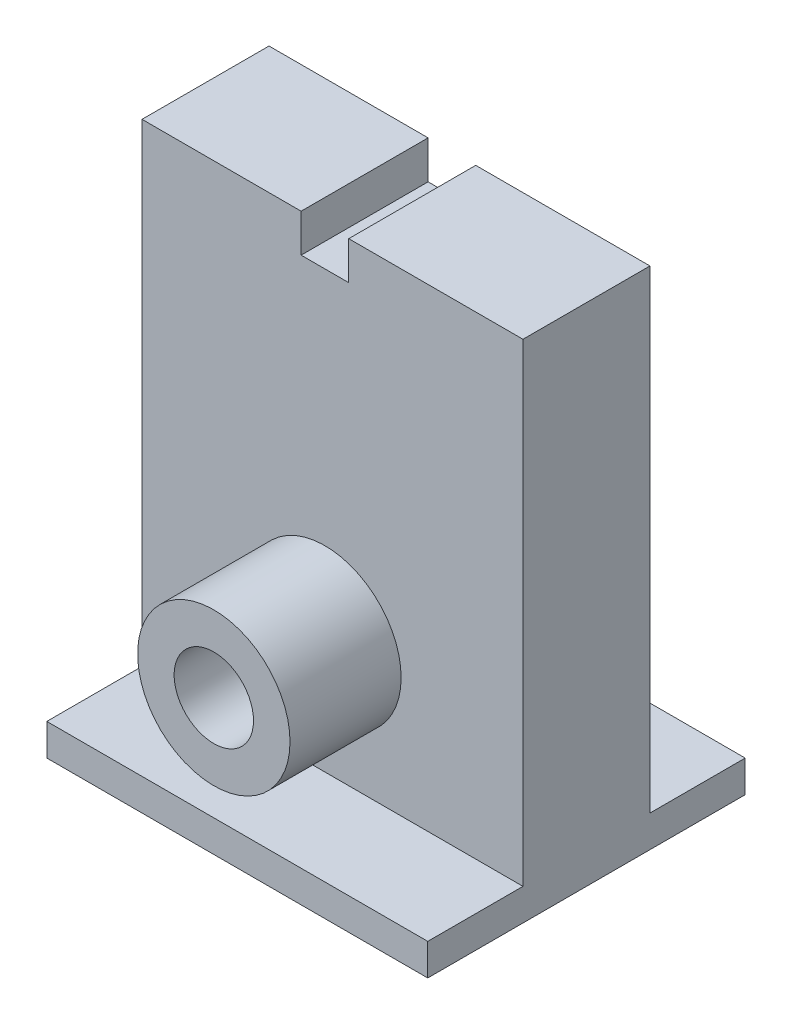
ISO-10303-21;
HEADER;
FILE_DESCRIPTION(('STEP AP214'),'2;1');
FILE_NAME('part.step','',(''),(''),'','','');
FILE_SCHEMA(('AUTOMOTIVE_DESIGN { 1 0 10303 214 1 1 1 1 }'));
ENDSEC;
DATA;
#1=APPLICATION_CONTEXT('core data for automotive mechanical design processes');
#2=APPLICATION_PROTOCOL_DEFINITION('international standard','automotive_design',2000,#1);
#3=PRODUCT_CONTEXT('',#1,'mechanical');
#4=PRODUCT('Part','Part','',(#3));
#5=PRODUCT_RELATED_PRODUCT_CATEGORY('part','',(#4));
#6=PRODUCT_DEFINITION_FORMATION('','',#4);
#7=PRODUCT_DEFINITION_CONTEXT('part definition',#1,'design');
#8=PRODUCT_DEFINITION('design','',#6,#7);
#9=PRODUCT_DEFINITION_SHAPE('','',#8);
#10=(LENGTH_UNIT() NAMED_UNIT(*) SI_UNIT(.MILLI.,.METRE.));
#11=(NAMED_UNIT(*) PLANE_ANGLE_UNIT() SI_UNIT($,.RADIAN.));
#12=(NAMED_UNIT(*) SI_UNIT($,.STERADIAN.) SOLID_ANGLE_UNIT());
#13=UNCERTAINTY_MEASURE_WITH_UNIT(LENGTH_MEASURE(1.E-05),#10,'distance_accuracy_value','');
#14=(GEOMETRIC_REPRESENTATION_CONTEXT(3) GLOBAL_UNCERTAINTY_ASSIGNED_CONTEXT((#13)) GLOBAL_UNIT_ASSIGNED_CONTEXT((#10,
#11,#12)) REPRESENTATION_CONTEXT('',''));
#15=CARTESIAN_POINT('',(0.,0.,0.));
#16=DIRECTION('',(0.,0.,1.));
#17=DIRECTION('',(1.,0.,0.));
#18=AXIS2_PLACEMENT_3D('',#15,#16,#17);
#19=CARTESIAN_POINT('',(-57.6145024875622,24.0242288557214,40.));
#20=DIRECTION('',(0.,-1.,0.));
#21=DIRECTION('',(0.,0.,-1.));
#22=AXIS2_PLACEMENT_3D('',#19,#20,#21);
#23=PLANE('',#22);
#24=DIRECTION('',(0.,0.,-1.));
#25=VECTOR('',#24,1.);
#26=CARTESIAN_POINT('',(-7.5,24.0242288557214,0.));
#27=LINE('',#26,#25);
#28=CARTESIAN_POINT('',(-7.5,24.0242288557214,40.));
#29=VERTEX_POINT('',#28);
#30=CARTESIAN_POINT('',(-7.5,24.0242288557214,0.));
#31=VERTEX_POINT('',#30);
#32=EDGE_CURVE('E198',#29,#31,#27,.T.);
#33=ORIENTED_EDGE('',*,*,#32,.F.);
#34=DIRECTION('',(-1.,0.,0.));
#35=VECTOR('',#34,1.);
#36=CARTESIAN_POINT('',(-57.6145024875622,24.0242288557214,40.));
#37=LINE('',#36,#35);
#38=CARTESIAN_POINT('',(7.50000000000001,24.0242288557214,40.));
#39=VERTEX_POINT('',#38);
#40=EDGE_CURVE('E237',#39,#29,#37,.T.);
#41=ORIENTED_EDGE('',*,*,#40,.F.);
#42=DIRECTION('',(0.,0.,1.));
#43=VECTOR('',#42,1.);
#44=CARTESIAN_POINT('',(7.5,24.0242288557214,0.));
#45=LINE('',#44,#43);
#46=CARTESIAN_POINT('',(7.5,24.0242288557214,0.));
#47=VERTEX_POINT('',#46);
#48=EDGE_CURVE('E208',#47,#39,#45,.T.);
#49=ORIENTED_EDGE('',*,*,#48,.F.);
#50=DIRECTION('',(-1.,0.,0.));
#51=VECTOR('',#50,1.);
#52=CARTESIAN_POINT('',(-57.6145024875622,24.0242288557214,0.));
#53=LINE('',#52,#51);
#54=EDGE_CURVE('E235',#47,#31,#53,.T.);
#55=ORIENTED_EDGE('',*,*,#54,.T.);
#56=EDGE_LOOP('',(#33,#41,#49,#55));
#57=FACE_BOUND('',#56,.T.);
#58=ADVANCED_FACE('F41',(#57),#23,.F.);
#59=CARTESIAN_POINT('',(-57.6145024875622,-123.225771144279,40.));
#60=DIRECTION('',(1.,0.,0.));
#61=DIRECTION('',(0.,1.,0.));
#62=AXIS2_PLACEMENT_3D('',#59,#60,#61);
#63=PLANE('',#62);
#64=DIRECTION('',(0.,-1.,0.));
#65=VECTOR('',#64,1.);
#66=CARTESIAN_POINT('',(-57.6145024875622,-123.225771144279,0.));
#67=LINE('',#66,#65);
#68=CARTESIAN_POINT('',(-57.6145024875622,36.0242288557214,0.));
#69=VERTEX_POINT('',#68);
#70=CARTESIAN_POINT('',(-57.6145024875622,-113.225771144279,0.));
#71=VERTEX_POINT('',#70);
#72=EDGE_CURVE('E214',#69,#71,#67,.T.);
#73=ORIENTED_EDGE('',*,*,#72,.T.);
#74=DIRECTION('',(0.,0.,-1.));
#75=VECTOR('',#74,1.);
#76=CARTESIAN_POINT('',(-57.6145024875622,-113.225771144279,-30.));
#77=LINE('',#76,#75);
#78=CARTESIAN_POINT('',(-57.6145024875622,-113.225771144279,-30.));
#79=VERTEX_POINT('',#78);
#80=EDGE_CURVE('E146',#71,#79,#77,.T.);
#81=ORIENTED_EDGE('',*,*,#80,.T.);
#82=DIRECTION('',(0.,-1.,0.));
#83=VECTOR('',#82,1.);
#84=CARTESIAN_POINT('',(-57.6145024875622,-113.225771144279,-30.));
#85=LINE('',#84,#83);
#86=CARTESIAN_POINT('',(-57.6145024875622,-123.225771144279,-30.));
#87=VERTEX_POINT('',#86);
#88=EDGE_CURVE('E137',#79,#87,#85,.T.);
#89=ORIENTED_EDGE('',*,*,#88,.T.);
#90=DIRECTION('',(0.,0.,-1.));
#91=VECTOR('',#90,1.);
#92=CARTESIAN_POINT('',(-57.6145024875622,-123.225771144279,40.));
#93=LINE('',#92,#91);
#94=CARTESIAN_POINT('',(-57.6145024875622,-123.225771144279,70.));
#95=VERTEX_POINT('',#94);
#96=EDGE_CURVE('E132',#95,#87,#93,.T.);
#97=ORIENTED_EDGE('',*,*,#96,.F.);
#98=DIRECTION('',(0.,-1.,0.));
#99=VECTOR('',#98,1.);
#100=CARTESIAN_POINT('',(-57.6145024875622,-113.225771144279,70.));
#101=LINE('',#100,#99);
#102=CARTESIAN_POINT('',(-57.6145024875622,-113.225771144279,70.));
#103=VERTEX_POINT('',#102);
#104=EDGE_CURVE('E127',#103,#95,#101,.T.);
#105=ORIENTED_EDGE('',*,*,#104,.F.);
#106=CARTESIAN_POINT('',(-57.6145024875622,-113.225771144279,40.));
#107=VERTEX_POINT('',#106);
#108=EDGE_CURVE('E130',#103,#107,#77,.T.);
#109=ORIENTED_EDGE('',*,*,#108,.T.);
#110=DIRECTION('',(0.,-1.,0.));
#111=VECTOR('',#110,1.);
#112=CARTESIAN_POINT('',(-57.6145024875622,-123.225771144279,40.));
#113=LINE('',#112,#111);
#114=CARTESIAN_POINT('',(-57.6145024875622,36.0242288557214,40.));
#115=VERTEX_POINT('',#114);
#116=EDGE_CURVE('E61',#115,#107,#113,.T.);
#117=ORIENTED_EDGE('',*,*,#116,.F.);
#118=DIRECTION('',(0.,0.,1.));
#119=VECTOR('',#118,1.);
#120=CARTESIAN_POINT('',(-57.6145024875622,36.0242288557214,40.));
#121=LINE('',#120,#119);
#122=EDGE_CURVE('E194',#69,#115,#121,.T.);
#123=ORIENTED_EDGE('',*,*,#122,.F.);
#124=EDGE_LOOP('',(#73,#81,#89,#97,#105,#109,#117,#123));
#125=FACE_BOUND('',#124,.T.);
#126=ADVANCED_FACE('F43',(#125),#63,.F.);
#127=CARTESIAN_POINT('',(62.3854975124378,-123.225771144279,40.));
#128=DIRECTION('',(0.,1.,0.));
#129=DIRECTION('',(-1.,0.,0.));
#130=AXIS2_PLACEMENT_3D('',#127,#128,#129);
#131=PLANE('',#130);
#132=ORIENTED_EDGE('',*,*,#96,.T.);
#133=DIRECTION('',(1.,0.,0.));
#134=VECTOR('',#133,1.);
#135=CARTESIAN_POINT('',(-57.6145024875622,-123.225771144279,-30.));
#136=LINE('',#135,#134);
#137=CARTESIAN_POINT('',(62.3854975124378,-123.225771144279,-30.));
#138=VERTEX_POINT('',#137);
#139=EDGE_CURVE('E152',#87,#138,#136,.T.);
#140=ORIENTED_EDGE('',*,*,#139,.T.);
#141=DIRECTION('',(0.,0.,-1.));
#142=VECTOR('',#141,1.);
#143=CARTESIAN_POINT('',(62.3854975124378,-123.225771144279,40.));
#144=LINE('',#143,#142);
#145=CARTESIAN_POINT('',(62.3854975124378,-123.225771144279,70.));
#146=VERTEX_POINT('',#145);
#147=EDGE_CURVE('E240',#146,#138,#144,.T.);
#148=ORIENTED_EDGE('',*,*,#147,.F.);
#149=DIRECTION('',(-1.,0.,0.));
#150=VECTOR('',#149,1.);
#151=CARTESIAN_POINT('',(-57.6145024875622,-123.225771144279,70.));
#152=LINE('',#151,#150);
#153=EDGE_CURVE('E155',#146,#95,#152,.T.);
#154=ORIENTED_EDGE('',*,*,#153,.T.);
#155=EDGE_LOOP('',(#132,#140,#148,#154));
#156=FACE_BOUND('',#155,.T.);
#157=ADVANCED_FACE('F246',(#156),#131,.F.);
#158=CARTESIAN_POINT('',(62.3854975124378,24.0242288557214,40.));
#159=DIRECTION('',(-1.,0.,0.));
#160=DIRECTION('',(0.,-1.,0.));
#161=AXIS2_PLACEMENT_3D('',#158,#159,#160);
#162=PLANE('',#161);
#163=DIRECTION('',(0.,1.,0.));
#164=VECTOR('',#163,1.);
#165=CARTESIAN_POINT('',(62.3854975124378,24.0242288557214,40.));
#166=LINE('',#165,#164);
#167=CARTESIAN_POINT('',(62.3854975124378,-113.225771144279,40.));
#168=VERTEX_POINT('',#167);
#169=CARTESIAN_POINT('',(62.3854975124378,36.0242288557214,40.));
#170=VERTEX_POINT('',#169);
#171=EDGE_CURVE('E234',#168,#170,#166,.T.);
#172=ORIENTED_EDGE('',*,*,#171,.F.);
#173=DIRECTION('',(0.,0.,1.));
#174=VECTOR('',#173,1.);
#175=CARTESIAN_POINT('',(62.3854975124378,-113.225771144279,70.));
#176=LINE('',#175,#174);
#177=CARTESIAN_POINT('',(62.3854975124378,-113.225771144279,70.));
#178=VERTEX_POINT('',#177);
#179=EDGE_CURVE('E160',#168,#178,#176,.T.);
#180=ORIENTED_EDGE('',*,*,#179,.T.);
#181=DIRECTION('',(0.,-1.,0.));
#182=VECTOR('',#181,1.);
#183=CARTESIAN_POINT('',(62.3854975124378,-113.225771144279,70.));
#184=LINE('',#183,#182);
#185=EDGE_CURVE('E151',#178,#146,#184,.T.);
#186=ORIENTED_EDGE('',*,*,#185,.T.);
#187=ORIENTED_EDGE('',*,*,#147,.T.);
#188=DIRECTION('',(0.,-1.,0.));
#189=VECTOR('',#188,1.);
#190=CARTESIAN_POINT('',(62.3854975124378,-113.225771144279,-30.));
#191=LINE('',#190,#189);
#192=CARTESIAN_POINT('',(62.3854975124378,-113.225771144279,-30.));
#193=VERTEX_POINT('',#192);
#194=EDGE_CURVE('E165',#193,#138,#191,.T.);
#195=ORIENTED_EDGE('',*,*,#194,.F.);
#196=CARTESIAN_POINT('',(62.3854975124378,-113.225771144279,0.));
#197=VERTEX_POINT('',#196);
#198=EDGE_CURVE('E138',#193,#197,#176,.T.);
#199=ORIENTED_EDGE('',*,*,#198,.T.);
#200=DIRECTION('',(0.,1.,0.));
#201=VECTOR('',#200,1.);
#202=CARTESIAN_POINT('',(62.3854975124378,24.0242288557214,0.));
#203=LINE('',#202,#201);
#204=CARTESIAN_POINT('',(62.3854975124378,36.0242288557214,0.));
#205=VERTEX_POINT('',#204);
#206=EDGE_CURVE('E242',#197,#205,#203,.T.);
#207=ORIENTED_EDGE('',*,*,#206,.T.);
#208=DIRECTION('',(0.,0.,-1.));
#209=VECTOR('',#208,1.);
#210=CARTESIAN_POINT('',(62.3854975124378,36.0242288557214,40.));
#211=LINE('',#210,#209);
#212=EDGE_CURVE('E220',#170,#205,#211,.T.);
#213=ORIENTED_EDGE('',*,*,#212,.F.);
#214=EDGE_LOOP('',(#172,#180,#186,#187,#195,#199,#207,#213));
#215=FACE_BOUND('',#214,.T.);
#216=ADVANCED_FACE('F254',(#215),#162,.F.);
#217=CARTESIAN_POINT('',(0.,0.,40.));
#218=DIRECTION('',(0.,0.,-1.));
#219=DIRECTION('',(-1.,0.,0.));
#220=AXIS2_PLACEMENT_3D('',#217,#218,#219);
#221=PLANE('',#220);
#222=CARTESIAN_POINT('',(0.,-75.4757711442786,40.));
#223=DIRECTION('',(0.,0.,1.));
#224=DIRECTION('',(1.,0.,0.));
#225=AXIS2_PLACEMENT_3D('',#222,#223,#224);
#226=CIRCLE('',#225,24.);
#227=CARTESIAN_POINT('',(24.,-75.4757711442786,40.));
#228=VERTEX_POINT('',#227);
#229=EDGE_CURVE('E176',#228,#228,#226,.T.);
#230=ORIENTED_EDGE('',*,*,#229,.F.);
#231=EDGE_LOOP('',(#230));
#232=FACE_BOUND('',#231,.T.);
#233=ORIENTED_EDGE('',*,*,#116,.T.);
#234=DIRECTION('',(1.,0.,0.));
#235=VECTOR('',#234,1.);
#236=CARTESIAN_POINT('',(0.,-113.225771144279,40.));
#237=LINE('',#236,#235);
#238=EDGE_CURVE('E56',#107,#168,#237,.T.);
#239=ORIENTED_EDGE('',*,*,#238,.T.);
#240=ORIENTED_EDGE('',*,*,#171,.T.);
#241=DIRECTION('',(1.,0.,0.));
#242=VECTOR('',#241,1.);
#243=CARTESIAN_POINT('',(7.50000000000001,36.0242288557214,40.));
#244=LINE('',#243,#242);
#245=CARTESIAN_POINT('',(7.50000000000001,36.0242288557214,40.));
#246=VERTEX_POINT('',#245);
#247=EDGE_CURVE('E226',#246,#170,#244,.T.);
#248=ORIENTED_EDGE('',*,*,#247,.F.);
#249=DIRECTION('',(0.,-1.,0.));
#250=VECTOR('',#249,1.);
#251=CARTESIAN_POINT('',(7.50000000000001,36.0242288557214,40.));
#252=LINE('',#251,#250);
#253=EDGE_CURVE('E217',#246,#39,#252,.T.);
#254=ORIENTED_EDGE('',*,*,#253,.T.);
#255=ORIENTED_EDGE('',*,*,#40,.T.);
#256=DIRECTION('',(0.,-1.,0.));
#257=VECTOR('',#256,1.);
#258=CARTESIAN_POINT('',(-7.5,36.0242288557214,40.));
#259=LINE('',#258,#257);
#260=CARTESIAN_POINT('',(-7.5,36.0242288557214,40.));
#261=VERTEX_POINT('',#260);
#262=EDGE_CURVE('E211',#261,#29,#259,.T.);
#263=ORIENTED_EDGE('',*,*,#262,.F.);
#264=DIRECTION('',(1.,0.,0.));
#265=VECTOR('',#264,1.);
#266=CARTESIAN_POINT('',(-7.5,36.0242288557214,40.));
#267=LINE('',#266,#265);
#268=EDGE_CURVE('E197',#115,#261,#267,.T.);
#269=ORIENTED_EDGE('',*,*,#268,.F.);
#270=EDGE_LOOP('',(#233,#239,#240,#248,#254,#255,#263,#269));
#271=FACE_BOUND('',#270,.T.);
#272=ADVANCED_FACE('F258',(#232,#271),#221,.F.);
#273=CARTESIAN_POINT('',(0.,0.,0.));
#274=DIRECTION('',(0.,0.,-1.));
#275=DIRECTION('',(-1.,0.,0.));
#276=AXIS2_PLACEMENT_3D('',#273,#274,#275);
#277=PLANE('',#276);
#278=DIRECTION('',(1.,0.,0.));
#279=VECTOR('',#278,1.);
#280=CARTESIAN_POINT('',(0.,-113.225771144279,0.));
#281=LINE('',#280,#279);
#282=EDGE_CURVE('E11',#71,#197,#281,.T.);
#283=ORIENTED_EDGE('',*,*,#282,.F.);
#284=ORIENTED_EDGE('',*,*,#72,.F.);
#285=DIRECTION('',(-1.,0.,0.));
#286=VECTOR('',#285,1.);
#287=CARTESIAN_POINT('',(-57.6145024875622,36.0242288557214,0.));
#288=LINE('',#287,#286);
#289=CARTESIAN_POINT('',(-7.5,36.0242288557214,0.));
#290=VERTEX_POINT('',#289);
#291=EDGE_CURVE('E202',#290,#69,#288,.T.);
#292=ORIENTED_EDGE('',*,*,#291,.F.);
#293=DIRECTION('',(0.,-1.,0.));
#294=VECTOR('',#293,1.);
#295=CARTESIAN_POINT('',(-7.5,36.0242288557214,0.));
#296=LINE('',#295,#294);
#297=EDGE_CURVE('E205',#290,#31,#296,.T.);
#298=ORIENTED_EDGE('',*,*,#297,.T.);
#299=ORIENTED_EDGE('',*,*,#54,.F.);
#300=DIRECTION('',(0.,-1.,0.));
#301=VECTOR('',#300,1.);
#302=CARTESIAN_POINT('',(7.5,36.0242288557214,0.));
#303=LINE('',#302,#301);
#304=CARTESIAN_POINT('',(7.5,36.0242288557214,0.));
#305=VERTEX_POINT('',#304);
#306=EDGE_CURVE('E191',#305,#47,#303,.T.);
#307=ORIENTED_EDGE('',*,*,#306,.F.);
#308=DIRECTION('',(-1.,0.,0.));
#309=VECTOR('',#308,1.);
#310=CARTESIAN_POINT('',(62.3854975124378,36.0242288557214,0.));
#311=LINE('',#310,#309);
#312=EDGE_CURVE('E223',#205,#305,#311,.T.);
#313=ORIENTED_EDGE('',*,*,#312,.F.);
#314=ORIENTED_EDGE('',*,*,#206,.F.);
#315=EDGE_LOOP('',(#283,#284,#292,#298,#299,#307,#313,#314));
#316=FACE_BOUND('',#315,.T.);
#317=CARTESIAN_POINT('',(0.,-75.4757711442786,0.));
#318=DIRECTION('',(0.,0.,1.));
#319=DIRECTION('',(1.,0.,0.));
#320=AXIS2_PLACEMENT_3D('',#317,#318,#319);
#321=CIRCLE('',#320,24.);
#322=CARTESIAN_POINT('',(24.,-75.4757711442786,0.));
#323=VERTEX_POINT('',#322);
#324=EDGE_CURVE('E173',#323,#323,#321,.T.);
#325=ORIENTED_EDGE('',*,*,#324,.T.);
#326=EDGE_LOOP('',(#325));
#327=FACE_BOUND('',#326,.T.);
#328=ADVANCED_FACE('F278',(#316,#327),#277,.T.);
#329=CARTESIAN_POINT('',(7.5,36.0242288557214,0.));
#330=DIRECTION('',(1.,0.,0.));
#331=DIRECTION('',(0.,0.,-1.));
#332=AXIS2_PLACEMENT_3D('',#329,#330,#331);
#333=PLANE('',#332);
#334=ORIENTED_EDGE('',*,*,#48,.T.);
#335=ORIENTED_EDGE('',*,*,#253,.F.);
#336=DIRECTION('',(0.,0.,1.));
#337=VECTOR('',#336,1.);
#338=CARTESIAN_POINT('',(7.5,36.0242288557214,0.));
#339=LINE('',#338,#337);
#340=EDGE_CURVE('E229',#305,#246,#339,.T.);
#341=ORIENTED_EDGE('',*,*,#340,.F.);
#342=ORIENTED_EDGE('',*,*,#306,.T.);
#343=EDGE_LOOP('',(#334,#335,#341,#342));
#344=FACE_BOUND('',#343,.T.);
#345=ADVANCED_FACE('F265',(#344),#333,.F.);
#346=CARTESIAN_POINT('',(0.,36.0242288557214,0.));
#347=DIRECTION('',(0.,1.,0.));
#348=DIRECTION('',(0.,0.,1.));
#349=AXIS2_PLACEMENT_3D('',#346,#347,#348);
#350=PLANE('',#349);
#351=ORIENTED_EDGE('',*,*,#312,.T.);
#352=ORIENTED_EDGE('',*,*,#340,.T.);
#353=ORIENTED_EDGE('',*,*,#247,.T.);
#354=ORIENTED_EDGE('',*,*,#212,.T.);
#355=EDGE_LOOP('',(#351,#352,#353,#354));
#356=FACE_BOUND('',#355,.T.);
#357=ADVANCED_FACE('F260',(#356),#350,.T.);
#358=CARTESIAN_POINT('',(-7.5,36.0242288557214,0.));
#359=DIRECTION('',(-1.,0.,0.));
#360=DIRECTION('',(0.,0.,1.));
#361=AXIS2_PLACEMENT_3D('',#358,#359,#360);
#362=PLANE('',#361);
#363=ORIENTED_EDGE('',*,*,#32,.T.);
#364=ORIENTED_EDGE('',*,*,#297,.F.);
#365=DIRECTION('',(0.,0.,-1.));
#366=VECTOR('',#365,1.);
#367=CARTESIAN_POINT('',(-7.5,36.0242288557214,0.));
#368=LINE('',#367,#366);
#369=EDGE_CURVE('E200',#261,#290,#368,.T.);
#370=ORIENTED_EDGE('',*,*,#369,.F.);
#371=ORIENTED_EDGE('',*,*,#262,.T.);
#372=EDGE_LOOP('',(#363,#364,#370,#371));
#373=FACE_BOUND('',#372,.T.);
#374=ADVANCED_FACE('F270',(#373),#362,.F.);
#375=CARTESIAN_POINT('',(0.,36.0242288557214,0.));
#376=DIRECTION('',(0.,-1.,0.));
#377=DIRECTION('',(0.,0.,-1.));
#378=AXIS2_PLACEMENT_3D('',#375,#376,#377);
#379=PLANE('',#378);
#380=ORIENTED_EDGE('',*,*,#122,.T.);
#381=ORIENTED_EDGE('',*,*,#268,.T.);
#382=ORIENTED_EDGE('',*,*,#369,.T.);
#383=ORIENTED_EDGE('',*,*,#291,.T.);
#384=EDGE_LOOP('',(#380,#381,#382,#383));
#385=FACE_BOUND('',#384,.T.);
#386=ADVANCED_FACE('F274',(#385),#379,.F.);
#387=CARTESIAN_POINT('',(0.,-75.4757711442786,75.));
#388=DIRECTION('',(0.,0.,1.));
#389=DIRECTION('',(1.,0.,0.));
#390=AXIS2_PLACEMENT_3D('',#387,#388,#389);
#391=PLANE('',#390);
#392=CARTESIAN_POINT('',(0.,-75.4757711442786,75.));
#393=DIRECTION('',(0.,0.,1.));
#394=DIRECTION('',(1.,0.,0.));
#395=AXIS2_PLACEMENT_3D('',#392,#393,#394);
#396=CIRCLE('',#395,24.);
#397=CARTESIAN_POINT('',(24.,-75.4757711442786,75.));
#398=VERTEX_POINT('',#397);
#399=EDGE_CURVE('E186',#398,#398,#396,.T.);
#400=ORIENTED_EDGE('',*,*,#399,.T.);
#401=EDGE_LOOP('',(#400));
#402=FACE_BOUND('',#401,.T.);
#403=CARTESIAN_POINT('',(0.,-75.4757711442786,75.));
#404=DIRECTION('',(0.,0.,1.));
#405=DIRECTION('',(1.,0.,0.));
#406=AXIS2_PLACEMENT_3D('',#403,#404,#405);
#407=CIRCLE('',#406,12.5);
#408=CARTESIAN_POINT('',(12.5,-75.4757711442786,75.));
#409=VERTEX_POINT('',#408);
#410=EDGE_CURVE('E183',#409,#409,#407,.T.);
#411=ORIENTED_EDGE('',*,*,#410,.F.);
#412=EDGE_LOOP('',(#411));
#413=FACE_BOUND('',#412,.T.);
#414=ADVANCED_FACE('F372',(#402,#413),#391,.T.);
#415=CARTESIAN_POINT('',(0.,-75.4757711442786,75.));
#416=DIRECTION('',(0.,0.,-1.));
#417=DIRECTION('',(-1.,0.,0.));
#418=AXIS2_PLACEMENT_3D('',#415,#416,#417);
#419=CYLINDRICAL_SURFACE('',#418,24.);
#420=ORIENTED_EDGE('',*,*,#399,.F.);
#421=EDGE_LOOP('',(#420));
#422=FACE_BOUND('',#421,.T.);
#423=ORIENTED_EDGE('',*,*,#229,.T.);
#424=EDGE_LOOP('',(#423));
#425=FACE_BOUND('',#424,.T.);
#426=ADVANCED_FACE('F370',(#422,#425),#419,.T.);
#427=CARTESIAN_POINT('',(0.,-75.4757711442786,75.));
#428=DIRECTION('',(0.,0.,-1.));
#429=DIRECTION('',(-1.,0.,0.));
#430=AXIS2_PLACEMENT_3D('',#427,#428,#429);
#431=CYLINDRICAL_SURFACE('',#430,12.5);
#432=ORIENTED_EDGE('',*,*,#410,.T.);
#433=EDGE_LOOP('',(#432));
#434=FACE_BOUND('',#433,.T.);
#435=CARTESIAN_POINT('',(0.,-75.4757711442786,40.));
#436=DIRECTION('',(0.,0.,1.));
#437=DIRECTION('',(1.,0.,0.));
#438=AXIS2_PLACEMENT_3D('',#435,#436,#437);
#439=CIRCLE('',#438,12.5);
#440=CARTESIAN_POINT('',(12.5,-75.4757711442786,40.));
#441=VERTEX_POINT('',#440);
#442=EDGE_CURVE('E180',#441,#441,#439,.T.);
#443=ORIENTED_EDGE('',*,*,#442,.F.);
#444=EDGE_LOOP('',(#443));
#445=FACE_BOUND('',#444,.T.);
#446=ADVANCED_FACE('F367',(#434,#445),#431,.F.);
#447=ORIENTED_EDGE('',*,*,#442,.T.);
#448=EDGE_LOOP('',(#447));
#449=FACE_BOUND('',#448,.T.);
#450=ADVANCED_FACE('F320',(#449),#221,.F.);
#451=CARTESIAN_POINT('',(0.,-75.4757711442786,-35.));
#452=DIRECTION('',(0.,0.,1.));
#453=DIRECTION('',(1.,0.,0.));
#454=AXIS2_PLACEMENT_3D('',#451,#452,#453);
#455=CYLINDRICAL_SURFACE('',#454,24.);
#456=CARTESIAN_POINT('',(0.,-75.4757711442786,-35.));
#457=DIRECTION('',(0.,0.,1.));
#458=DIRECTION('',(1.,0.,0.));
#459=AXIS2_PLACEMENT_3D('',#456,#457,#458);
#460=CIRCLE('',#459,24.);
#461=CARTESIAN_POINT('',(24.,-75.4757711442786,-35.));
#462=VERTEX_POINT('',#461);
#463=EDGE_CURVE('E177',#462,#462,#460,.T.);
#464=ORIENTED_EDGE('',*,*,#463,.T.);
#465=EDGE_LOOP('',(#464));
#466=FACE_BOUND('',#465,.T.);
#467=ORIENTED_EDGE('',*,*,#324,.F.);
#468=EDGE_LOOP('',(#467));
#469=FACE_BOUND('',#468,.T.);
#470=ADVANCED_FACE('F362',(#466,#469),#455,.T.);
#471=CARTESIAN_POINT('',(0.,-75.4757711442786,-35.));
#472=DIRECTION('',(0.,0.,-1.));
#473=DIRECTION('',(1.,0.,0.));
#474=AXIS2_PLACEMENT_3D('',#471,#472,#473);
#475=PLANE('',#474);
#476=CARTESIAN_POINT('',(0.,-75.4757711442786,-35.));
#477=DIRECTION('',(0.,0.,1.));
#478=DIRECTION('',(1.,0.,0.));
#479=AXIS2_PLACEMENT_3D('',#476,#477,#478);
#480=CIRCLE('',#479,12.5);
#481=CARTESIAN_POINT('',(12.5,-75.4757711442786,-35.));
#482=VERTEX_POINT('',#481);
#483=EDGE_CURVE('E170',#482,#482,#480,.T.);
#484=ORIENTED_EDGE('',*,*,#483,.T.);
#485=EDGE_LOOP('',(#484));
#486=FACE_BOUND('',#485,.T.);
#487=ORIENTED_EDGE('',*,*,#463,.F.);
#488=EDGE_LOOP('',(#487));
#489=FACE_BOUND('',#488,.T.);
#490=ADVANCED_FACE('F358',(#486,#489),#475,.T.);
#491=CARTESIAN_POINT('',(0.,-75.4757711442786,-35.));
#492=DIRECTION('',(0.,0.,1.));
#493=DIRECTION('',(1.,0.,0.));
#494=AXIS2_PLACEMENT_3D('',#491,#492,#493);
#495=CYLINDRICAL_SURFACE('',#494,12.5);
#496=ORIENTED_EDGE('',*,*,#483,.F.);
#497=EDGE_LOOP('',(#496));
#498=FACE_BOUND('',#497,.T.);
#499=CARTESIAN_POINT('',(0.,-75.4757711442786,0.));
#500=DIRECTION('',(0.,0.,1.));
#501=DIRECTION('',(1.,0.,0.));
#502=AXIS2_PLACEMENT_3D('',#499,#500,#501);
#503=CIRCLE('',#502,12.5);
#504=CARTESIAN_POINT('',(12.5,-75.4757711442786,0.));
#505=VERTEX_POINT('',#504);
#506=EDGE_CURVE('E49',#505,#505,#503,.T.);
#507=ORIENTED_EDGE('',*,*,#506,.T.);
#508=EDGE_LOOP('',(#507));
#509=FACE_BOUND('',#508,.T.);
#510=ADVANCED_FACE('F355',(#498,#509),#495,.F.);
#511=ORIENTED_EDGE('',*,*,#506,.F.);
#512=EDGE_LOOP('',(#511));
#513=FACE_BOUND('',#512,.T.);
#514=ADVANCED_FACE('F288',(#513),#277,.T.);
#515=CARTESIAN_POINT('',(-57.6145024875622,-113.225771144279,-30.));
#516=DIRECTION('',(0.,0.,-1.));
#517=DIRECTION('',(-1.,0.,0.));
#518=AXIS2_PLACEMENT_3D('',#515,#516,#517);
#519=PLANE('',#518);
#520=ORIENTED_EDGE('',*,*,#139,.F.);
#521=ORIENTED_EDGE('',*,*,#88,.F.);
#522=DIRECTION('',(1.,0.,0.));
#523=VECTOR('',#522,1.);
#524=CARTESIAN_POINT('',(-57.6145024875622,-113.225771144279,-30.));
#525=LINE('',#524,#523);
#526=EDGE_CURVE('E145',#79,#193,#525,.T.);
#527=ORIENTED_EDGE('',*,*,#526,.T.);
#528=ORIENTED_EDGE('',*,*,#194,.T.);
#529=EDGE_LOOP('',(#520,#521,#527,#528));
#530=FACE_BOUND('',#529,.T.);
#531=ADVANCED_FACE('F251',(#530),#519,.T.);
#532=CARTESIAN_POINT('',(0.,-113.225771144279,0.));
#533=DIRECTION('',(0.,1.,0.));
#534=DIRECTION('',(-1.,0.,0.));
#535=AXIS2_PLACEMENT_3D('',#532,#533,#534);
#536=PLANE('',#535);
#537=ORIENTED_EDGE('',*,*,#80,.F.);
#538=ORIENTED_EDGE('',*,*,#282,.T.);
#539=ORIENTED_EDGE('',*,*,#198,.F.);
#540=ORIENTED_EDGE('',*,*,#526,.F.);
#541=EDGE_LOOP('',(#537,#538,#539,#540));
#542=FACE_BOUND('',#541,.T.);
#543=ADVANCED_FACE('F281',(#542),#536,.T.);
#544=ORIENTED_EDGE('',*,*,#238,.F.);
#545=ORIENTED_EDGE('',*,*,#108,.F.);
#546=DIRECTION('',(-1.,0.,0.));
#547=VECTOR('',#546,1.);
#548=CARTESIAN_POINT('',(-57.6145024875622,-113.225771144279,70.));
#549=LINE('',#548,#547);
#550=EDGE_CURVE('E144',#178,#103,#549,.T.);
#551=ORIENTED_EDGE('',*,*,#550,.F.);
#552=ORIENTED_EDGE('',*,*,#179,.F.);
#553=EDGE_LOOP('',(#544,#545,#551,#552));
#554=FACE_BOUND('',#553,.T.);
#555=ADVANCED_FACE('F142',(#554),#536,.T.);
#556=CARTESIAN_POINT('',(-57.6145024875622,-113.225771144279,70.));
#557=DIRECTION('',(0.,0.,1.));
#558=DIRECTION('',(1.,0.,0.));
#559=AXIS2_PLACEMENT_3D('',#556,#557,#558);
#560=PLANE('',#559);
#561=ORIENTED_EDGE('',*,*,#153,.F.);
#562=ORIENTED_EDGE('',*,*,#185,.F.);
#563=ORIENTED_EDGE('',*,*,#550,.T.);
#564=ORIENTED_EDGE('',*,*,#104,.T.);
#565=EDGE_LOOP('',(#561,#562,#563,#564));
#566=FACE_BOUND('',#565,.T.);
#567=ADVANCED_FACE('F149',(#566),#560,.T.);
#568=CLOSED_SHELL('',(#58,#126,#157,#216,#272,#328,#345,#357,#374,#386,#414,#426,#446,#450,#470,
#490,#510,#514,#531,#543,#555,#567));
#569=MANIFOLD_SOLID_BREP('B2',#568);
#570=ADVANCED_BREP_SHAPE_REPRESENTATION('',(#18,#569),#14);
#571=SHAPE_DEFINITION_REPRESENTATION(#9,#570);
ENDSEC;
END-ISO-10303-21;
